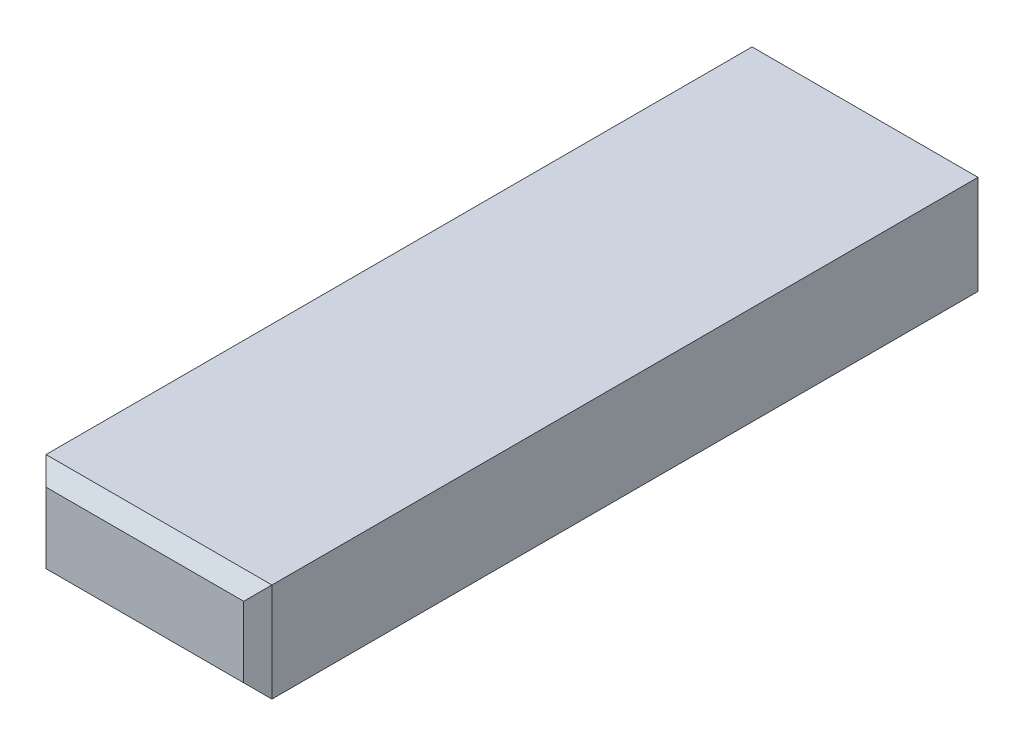
ISO-10303-21;
HEADER;
FILE_DESCRIPTION(('STEP AP214'),'2;1');
FILE_NAME('part.step','',(''),(''),'','','');
FILE_SCHEMA(('AUTOMOTIVE_DESIGN { 1 0 10303 214 1 1 1 1 }'));
ENDSEC;
DATA;
#1=APPLICATION_CONTEXT('core data for automotive mechanical design processes');
#2=APPLICATION_PROTOCOL_DEFINITION('international standard','automotive_design',2000,#1);
#3=PRODUCT_CONTEXT('',#1,'mechanical');
#4=PRODUCT('Part','Part','',(#3));
#5=PRODUCT_RELATED_PRODUCT_CATEGORY('part','',(#4));
#6=PRODUCT_DEFINITION_FORMATION('','',#4);
#7=PRODUCT_DEFINITION_CONTEXT('part definition',#1,'design');
#8=PRODUCT_DEFINITION('design','',#6,#7);
#9=PRODUCT_DEFINITION_SHAPE('','',#8);
#10=(LENGTH_UNIT() NAMED_UNIT(*) SI_UNIT(.MILLI.,.METRE.));
#11=(NAMED_UNIT(*) PLANE_ANGLE_UNIT() SI_UNIT($,.RADIAN.));
#12=(NAMED_UNIT(*) SI_UNIT($,.STERADIAN.) SOLID_ANGLE_UNIT());
#13=UNCERTAINTY_MEASURE_WITH_UNIT(LENGTH_MEASURE(1.E-05),#10,'distance_accuracy_value','');
#14=(GEOMETRIC_REPRESENTATION_CONTEXT(3) GLOBAL_UNCERTAINTY_ASSIGNED_CONTEXT((#13)) GLOBAL_UNIT_ASSIGNED_CONTEXT((#10,
#11,#12)) REPRESENTATION_CONTEXT('',''));
#15=CARTESIAN_POINT('',(0.,0.,0.));
#16=DIRECTION('',(0.,0.,1.));
#17=DIRECTION('',(1.,0.,0.));
#18=AXIS2_PLACEMENT_3D('',#15,#16,#17);
#19=CARTESIAN_POINT('',(4.,1.75,5.));
#20=DIRECTION('',(-1.,0.,0.));
#21=DIRECTION('',(0.,0.,1.));
#22=AXIS2_PLACEMENT_3D('',#19,#20,#21);
#23=PLANE('',#22);
#24=DIRECTION('',(0.,0.,-1.));
#25=VECTOR('',#24,1.);
#26=CARTESIAN_POINT('',(4.,-1.75,5.));
#27=LINE('',#26,#25);
#28=CARTESIAN_POINT('',(4.,-1.75,12.5));
#29=VERTEX_POINT('',#28);
#30=CARTESIAN_POINT('',(4.,-1.75,-12.5));
#31=VERTEX_POINT('',#30);
#32=EDGE_CURVE('E130',#29,#31,#27,.T.);
#33=ORIENTED_EDGE('',*,*,#32,.T.);
#34=DIRECTION('',(0.,1.,0.));
#35=VECTOR('',#34,1.);
#36=CARTESIAN_POINT('',(4.,1.75,-12.5));
#37=LINE('',#36,#35);
#38=CARTESIAN_POINT('',(4.,1.75,-12.5));
#39=VERTEX_POINT('',#38);
#40=EDGE_CURVE('E154',#31,#39,#37,.T.);
#41=ORIENTED_EDGE('',*,*,#40,.T.);
#42=DIRECTION('',(0.,0.,-1.));
#43=VECTOR('',#42,1.);
#44=CARTESIAN_POINT('',(4.,1.75,5.));
#45=LINE('',#44,#43);
#46=CARTESIAN_POINT('',(4.,1.75,12.5));
#47=VERTEX_POINT('',#46);
#48=EDGE_CURVE('E136',#47,#39,#45,.T.);
#49=ORIENTED_EDGE('',*,*,#48,.F.);
#50=DIRECTION('',(0.,-1.,0.));
#51=VECTOR('',#50,1.);
#52=CARTESIAN_POINT('',(4.,-1.75,12.5));
#53=LINE('',#52,#51);
#54=EDGE_CURVE('E151',#47,#29,#53,.T.);
#55=ORIENTED_EDGE('',*,*,#54,.T.);
#56=EDGE_LOOP('',(#33,#41,#49,#55));
#57=FACE_BOUND('',#56,.T.);
#58=ADVANCED_FACE('F43',(#57),#23,.F.);
#59=CARTESIAN_POINT('',(-4.,1.75,5.));
#60=DIRECTION('',(0.,-1.,0.));
#61=DIRECTION('',(0.,0.,-1.));
#62=AXIS2_PLACEMENT_3D('',#59,#60,#61);
#63=PLANE('',#62);
#64=ORIENTED_EDGE('',*,*,#48,.T.);
#65=DIRECTION('',(-1.,0.,0.));
#66=VECTOR('',#65,1.);
#67=CARTESIAN_POINT('',(-4.,1.75,-12.5));
#68=LINE('',#67,#66);
#69=CARTESIAN_POINT('',(-4.,1.75,-12.5));
#70=VERTEX_POINT('',#69);
#71=EDGE_CURVE('E148',#39,#70,#68,.T.);
#72=ORIENTED_EDGE('',*,*,#71,.T.);
#73=DIRECTION('',(0.,0.,-1.));
#74=VECTOR('',#73,1.);
#75=CARTESIAN_POINT('',(-4.,1.75,5.));
#76=LINE('',#75,#74);
#77=CARTESIAN_POINT('',(-4.,1.75,12.5));
#78=VERTEX_POINT('',#77);
#79=EDGE_CURVE('E139',#78,#70,#76,.T.);
#80=ORIENTED_EDGE('',*,*,#79,.F.);
#81=DIRECTION('',(1.,0.,0.));
#82=VECTOR('',#81,1.);
#83=CARTESIAN_POINT('',(4.,1.75,12.5));
#84=LINE('',#83,#82);
#85=EDGE_CURVE('E146',#78,#47,#84,.T.);
#86=ORIENTED_EDGE('',*,*,#85,.T.);
#87=EDGE_LOOP('',(#64,#72,#80,#86));
#88=FACE_BOUND('',#87,.T.);
#89=ADVANCED_FACE('F207',(#88),#63,.F.);
#90=CARTESIAN_POINT('',(-4.,1.75,5.));
#91=DIRECTION('',(1.,0.,0.));
#92=DIRECTION('',(0.,0.,-1.));
#93=AXIS2_PLACEMENT_3D('',#90,#91,#92);
#94=PLANE('',#93);
#95=ORIENTED_EDGE('',*,*,#79,.T.);
#96=DIRECTION('',(0.,-1.,0.));
#97=VECTOR('',#96,1.);
#98=CARTESIAN_POINT('',(-4.,-1.75,-12.5));
#99=LINE('',#98,#97);
#100=CARTESIAN_POINT('',(-4.,-1.75,-12.5));
#101=VERTEX_POINT('',#100);
#102=EDGE_CURVE('E161',#70,#101,#99,.T.);
#103=ORIENTED_EDGE('',*,*,#102,.T.);
#104=DIRECTION('',(0.,0.,-1.));
#105=VECTOR('',#104,1.);
#106=CARTESIAN_POINT('',(-4.,-1.75,5.));
#107=LINE('',#106,#105);
#108=CARTESIAN_POINT('',(-4.,-1.75,12.5));
#109=VERTEX_POINT('',#108);
#110=EDGE_CURVE('E199',#109,#101,#107,.T.);
#111=ORIENTED_EDGE('',*,*,#110,.F.);
#112=DIRECTION('',(0.,1.,0.));
#113=VECTOR('',#112,1.);
#114=CARTESIAN_POINT('',(-4.,1.75,12.5));
#115=LINE('',#114,#113);
#116=EDGE_CURVE('E159',#109,#78,#115,.T.);
#117=ORIENTED_EDGE('',*,*,#116,.T.);
#118=EDGE_LOOP('',(#95,#103,#111,#117));
#119=FACE_BOUND('',#118,.T.);
#120=ADVANCED_FACE('F205',(#119),#94,.F.);
#121=CARTESIAN_POINT('',(-4.,-1.75,5.));
#122=DIRECTION('',(0.,1.,0.));
#123=DIRECTION('',(0.,0.,1.));
#124=AXIS2_PLACEMENT_3D('',#121,#122,#123);
#125=PLANE('',#124);
#126=ORIENTED_EDGE('',*,*,#110,.T.);
#127=DIRECTION('',(1.,0.,0.));
#128=VECTOR('',#127,1.);
#129=CARTESIAN_POINT('',(4.,-1.75,-12.5));
#130=LINE('',#129,#128);
#131=EDGE_CURVE('E127',#101,#31,#130,.T.);
#132=ORIENTED_EDGE('',*,*,#131,.T.);
#133=ORIENTED_EDGE('',*,*,#32,.F.);
#134=DIRECTION('',(-1.,0.,0.));
#135=VECTOR('',#134,1.);
#136=CARTESIAN_POINT('',(-4.,-1.75,12.5));
#137=LINE('',#136,#135);
#138=EDGE_CURVE('E156',#29,#109,#137,.T.);
#139=ORIENTED_EDGE('',*,*,#138,.T.);
#140=EDGE_LOOP('',(#126,#132,#133,#139));
#141=FACE_BOUND('',#140,.T.);
#142=ADVANCED_FACE('F198',(#141),#125,.F.);
#143=CARTESIAN_POINT('',(0.,0.,-13.));
#144=DIRECTION('',(0.,0.,-1.));
#145=DIRECTION('',(-1.,0.,0.));
#146=AXIS2_PLACEMENT_3D('',#143,#144,#145);
#147=PLANE('',#146);
#148=DIRECTION('',(0.,1.,0.));
#149=VECTOR('',#148,1.);
#150=CARTESIAN_POINT('',(-3.5,1.75,-13.));
#151=LINE('',#150,#149);
#152=CARTESIAN_POINT('',(-3.5,-1.25,-13.));
#153=VERTEX_POINT('',#152);
#154=CARTESIAN_POINT('',(-3.5,1.25,-13.));
#155=VERTEX_POINT('',#154);
#156=EDGE_CURVE('E115',#153,#155,#151,.T.);
#157=ORIENTED_EDGE('',*,*,#156,.T.);
#158=DIRECTION('',(1.,0.,0.));
#159=VECTOR('',#158,1.);
#160=CARTESIAN_POINT('',(4.,1.25,-13.));
#161=LINE('',#160,#159);
#162=CARTESIAN_POINT('',(3.5,1.25,-13.));
#163=VERTEX_POINT('',#162);
#164=EDGE_CURVE('E144',#155,#163,#161,.T.);
#165=ORIENTED_EDGE('',*,*,#164,.T.);
#166=DIRECTION('',(0.,-1.,0.));
#167=VECTOR('',#166,1.);
#168=CARTESIAN_POINT('',(3.5,-1.75,-13.));
#169=LINE('',#168,#167);
#170=CARTESIAN_POINT('',(3.5,-1.25,-13.));
#171=VERTEX_POINT('',#170);
#172=EDGE_CURVE('E118',#163,#171,#169,.T.);
#173=ORIENTED_EDGE('',*,*,#172,.T.);
#174=DIRECTION('',(-1.,0.,0.));
#175=VECTOR('',#174,1.);
#176=CARTESIAN_POINT('',(-4.,-1.25,-13.));
#177=LINE('',#176,#175);
#178=EDGE_CURVE('E110',#171,#153,#177,.T.);
#179=ORIENTED_EDGE('',*,*,#178,.T.);
#180=EDGE_LOOP('',(#157,#165,#173,#179));
#181=FACE_BOUND('',#180,.T.);
#182=ADVANCED_FACE('F112',(#181),#147,.T.);
#183=CARTESIAN_POINT('',(0.,0.,13.));
#184=DIRECTION('',(0.,0.,1.));
#185=DIRECTION('',(-1.,0.,0.));
#186=AXIS2_PLACEMENT_3D('',#183,#184,#185);
#187=PLANE('',#186);
#188=DIRECTION('',(1.,0.,0.));
#189=VECTOR('',#188,1.);
#190=CARTESIAN_POINT('',(4.,-1.25,13.));
#191=LINE('',#190,#189);
#192=CARTESIAN_POINT('',(-3.5,-1.25,13.));
#193=VERTEX_POINT('',#192);
#194=CARTESIAN_POINT('',(3.5,-1.25,13.));
#195=VERTEX_POINT('',#194);
#196=EDGE_CURVE('E163',#193,#195,#191,.T.);
#197=ORIENTED_EDGE('',*,*,#196,.T.);
#198=DIRECTION('',(0.,1.,0.));
#199=VECTOR('',#198,1.);
#200=CARTESIAN_POINT('',(3.5,1.75,13.));
#201=LINE('',#200,#199);
#202=CARTESIAN_POINT('',(3.5,1.25,13.));
#203=VERTEX_POINT('',#202);
#204=EDGE_CURVE('E11',#195,#203,#201,.T.);
#205=ORIENTED_EDGE('',*,*,#204,.T.);
#206=DIRECTION('',(-1.,0.,0.));
#207=VECTOR('',#206,1.);
#208=CARTESIAN_POINT('',(-4.,1.25,13.));
#209=LINE('',#208,#207);
#210=CARTESIAN_POINT('',(-3.5,1.25,13.));
#211=VERTEX_POINT('',#210);
#212=EDGE_CURVE('E53',#203,#211,#209,.T.);
#213=ORIENTED_EDGE('',*,*,#212,.T.);
#214=DIRECTION('',(0.,-1.,0.));
#215=VECTOR('',#214,1.);
#216=CARTESIAN_POINT('',(-3.5,-1.75,13.));
#217=LINE('',#216,#215);
#218=EDGE_CURVE('E165',#211,#193,#217,.T.);
#219=ORIENTED_EDGE('',*,*,#218,.T.);
#220=EDGE_LOOP('',(#197,#205,#213,#219));
#221=FACE_BOUND('',#220,.T.);
#222=ADVANCED_FACE('F187',(#221),#187,.T.);
#223=CARTESIAN_POINT('',(0.,-1.25,-13.));
#224=DIRECTION('',(0.,-0.707106781186547,-0.707106781186547));
#225=DIRECTION('',(1.,0.,0.));
#226=AXIS2_PLACEMENT_3D('',#223,#224,#225);
#227=PLANE('',#226);
#228=DIRECTION('',(0.577350269189626,-0.577350269189626,0.577350269189626));
#229=VECTOR('',#228,1.);
#230=CARTESIAN_POINT('',(2.33333333333333,-0.0833333333333328,-14.1666666666667));
#231=LINE('',#230,#229);
#232=EDGE_CURVE('E131',#31,#171,#231,.F.);
#233=ORIENTED_EDGE('',*,*,#232,.F.);
#234=ORIENTED_EDGE('',*,*,#131,.F.);
#235=DIRECTION('',(-0.577350269189626,-0.577350269189626,0.577350269189626));
#236=VECTOR('',#235,1.);
#237=CARTESIAN_POINT('',(-3.08333333333333,-0.833333333333333,-13.4166666666667));
#238=LINE('',#237,#236);
#239=EDGE_CURVE('E125',#153,#101,#238,.T.);
#240=ORIENTED_EDGE('',*,*,#239,.F.);
#241=ORIENTED_EDGE('',*,*,#178,.F.);
#242=EDGE_LOOP('',(#233,#234,#240,#241));
#243=FACE_BOUND('',#242,.T.);
#244=ADVANCED_FACE('F126',(#243),#227,.T.);
#245=CARTESIAN_POINT('',(-3.5,0.,-13.));
#246=DIRECTION('',(-0.707106781186547,0.,-0.707106781186547));
#247=DIRECTION('',(0.,-1.,0.));
#248=AXIS2_PLACEMENT_3D('',#245,#246,#247);
#249=PLANE('',#248);
#250=ORIENTED_EDGE('',*,*,#239,.T.);
#251=ORIENTED_EDGE('',*,*,#102,.F.);
#252=DIRECTION('',(0.577350269189626,-0.577350269189626,-0.577350269189626));
#253=VECTOR('',#252,1.);
#254=CARTESIAN_POINT('',(-3.08333333333333,0.833333333333333,-13.4166666666667));
#255=LINE('',#254,#253);
#256=EDGE_CURVE('E134',#155,#70,#255,.F.);
#257=ORIENTED_EDGE('',*,*,#256,.F.);
#258=ORIENTED_EDGE('',*,*,#156,.F.);
#259=EDGE_LOOP('',(#250,#251,#257,#258));
#260=FACE_BOUND('',#259,.T.);
#261=ADVANCED_FACE('F133',(#260),#249,.T.);
#262=CARTESIAN_POINT('',(3.5,0.,-13.));
#263=DIRECTION('',(0.707106781186547,0.,-0.707106781186547));
#264=DIRECTION('',(0.,1.,0.));
#265=AXIS2_PLACEMENT_3D('',#262,#263,#264);
#266=PLANE('',#265);
#267=ORIENTED_EDGE('',*,*,#232,.T.);
#268=ORIENTED_EDGE('',*,*,#172,.F.);
#269=DIRECTION('',(0.577350269189626,0.577350269189626,0.577350269189626));
#270=VECTOR('',#269,1.);
#271=CARTESIAN_POINT('',(3.08333333333333,0.833333333333333,-13.4166666666667));
#272=LINE('',#271,#270);
#273=EDGE_CURVE('E168',#39,#163,#272,.F.);
#274=ORIENTED_EDGE('',*,*,#273,.F.);
#275=ORIENTED_EDGE('',*,*,#40,.F.);
#276=EDGE_LOOP('',(#267,#268,#274,#275));
#277=FACE_BOUND('',#276,.T.);
#278=ADVANCED_FACE('F214',(#277),#266,.T.);
#279=CARTESIAN_POINT('',(0.,1.25,-13.));
#280=DIRECTION('',(0.,0.707106781186547,-0.707106781186547));
#281=DIRECTION('',(-1.,0.,0.));
#282=AXIS2_PLACEMENT_3D('',#279,#280,#281);
#283=PLANE('',#282);
#284=ORIENTED_EDGE('',*,*,#256,.T.);
#285=ORIENTED_EDGE('',*,*,#71,.F.);
#286=ORIENTED_EDGE('',*,*,#273,.T.);
#287=ORIENTED_EDGE('',*,*,#164,.F.);
#288=EDGE_LOOP('',(#284,#285,#286,#287));
#289=FACE_BOUND('',#288,.T.);
#290=ADVANCED_FACE('F211',(#289),#283,.T.);
#291=CARTESIAN_POINT('',(-4.,1.75,12.5));
#292=DIRECTION('',(-0.707106781186547,0.,0.707106781186547));
#293=DIRECTION('',(0.,-1.,0.));
#294=AXIS2_PLACEMENT_3D('',#291,#292,#293);
#295=PLANE('',#294);
#296=DIRECTION('',(-0.577350269189626,-0.577350269189626,-0.577350269189626));
#297=VECTOR('',#296,1.);
#298=CARTESIAN_POINT('',(-4.,-1.75,12.5));
#299=LINE('',#298,#297);
#300=EDGE_CURVE('E174',#193,#109,#299,.T.);
#301=ORIENTED_EDGE('',*,*,#300,.F.);
#302=ORIENTED_EDGE('',*,*,#218,.F.);
#303=DIRECTION('',(-0.577350269189626,0.577350269189626,-0.577350269189626));
#304=VECTOR('',#303,1.);
#305=CARTESIAN_POINT('',(-4.,1.75,12.5));
#306=LINE('',#305,#304);
#307=EDGE_CURVE('E48',#78,#211,#306,.F.);
#308=ORIENTED_EDGE('',*,*,#307,.F.);
#309=ORIENTED_EDGE('',*,*,#116,.F.);
#310=EDGE_LOOP('',(#301,#302,#308,#309));
#311=FACE_BOUND('',#310,.T.);
#312=ADVANCED_FACE('F46',(#311),#295,.T.);
#313=CARTESIAN_POINT('',(-4.,1.75,12.5));
#314=DIRECTION('',(0.,0.707106781186547,0.707106781186547));
#315=DIRECTION('',(-1.,0.,0.));
#316=AXIS2_PLACEMENT_3D('',#313,#314,#315);
#317=PLANE('',#316);
#318=ORIENTED_EDGE('',*,*,#307,.T.);
#319=ORIENTED_EDGE('',*,*,#212,.F.);
#320=DIRECTION('',(0.577350269189626,0.577350269189626,-0.577350269189626));
#321=VECTOR('',#320,1.);
#322=CARTESIAN_POINT('',(1.33333333333333,-0.916666666666667,15.1666666666667));
#323=LINE('',#322,#321);
#324=EDGE_CURVE('E61',#47,#203,#323,.F.);
#325=ORIENTED_EDGE('',*,*,#324,.F.);
#326=ORIENTED_EDGE('',*,*,#85,.F.);
#327=EDGE_LOOP('',(#318,#319,#325,#326));
#328=FACE_BOUND('',#327,.T.);
#329=ADVANCED_FACE('F184',(#328),#317,.T.);
#330=CARTESIAN_POINT('',(-4.,-1.75,12.5));
#331=DIRECTION('',(0.,-0.707106781186547,0.707106781186547));
#332=DIRECTION('',(1.,0.,0.));
#333=AXIS2_PLACEMENT_3D('',#330,#331,#332);
#334=PLANE('',#333);
#335=ORIENTED_EDGE('',*,*,#300,.T.);
#336=ORIENTED_EDGE('',*,*,#138,.F.);
#337=DIRECTION('',(-0.577350269189626,0.577350269189626,0.577350269189626));
#338=VECTOR('',#337,1.);
#339=CARTESIAN_POINT('',(1.33333333333333,0.916666666666667,15.1666666666667));
#340=LINE('',#339,#338);
#341=EDGE_CURVE('E172',#195,#29,#340,.F.);
#342=ORIENTED_EDGE('',*,*,#341,.F.);
#343=ORIENTED_EDGE('',*,*,#196,.F.);
#344=EDGE_LOOP('',(#335,#336,#342,#343));
#345=FACE_BOUND('',#344,.T.);
#346=ADVANCED_FACE('F190',(#345),#334,.T.);
#347=CARTESIAN_POINT('',(4.,1.75,12.5));
#348=DIRECTION('',(0.707106781186547,0.,0.707106781186547));
#349=DIRECTION('',(0.,1.,0.));
#350=AXIS2_PLACEMENT_3D('',#347,#348,#349);
#351=PLANE('',#350);
#352=ORIENTED_EDGE('',*,*,#324,.T.);
#353=ORIENTED_EDGE('',*,*,#204,.F.);
#354=ORIENTED_EDGE('',*,*,#341,.T.);
#355=ORIENTED_EDGE('',*,*,#54,.F.);
#356=EDGE_LOOP('',(#352,#353,#354,#355));
#357=FACE_BOUND('',#356,.T.);
#358=ADVANCED_FACE('F189',(#357),#351,.T.);
#359=CLOSED_SHELL('',(#58,#89,#120,#142,#182,#222,#244,#261,#278,#290,#312,#329,#346,#358));
#360=MANIFOLD_SOLID_BREP('B2',#359);
#361=ADVANCED_BREP_SHAPE_REPRESENTATION('',(#18,#360),#14);
#362=SHAPE_DEFINITION_REPRESENTATION(#9,#361);
ENDSEC;
END-ISO-10303-21;
